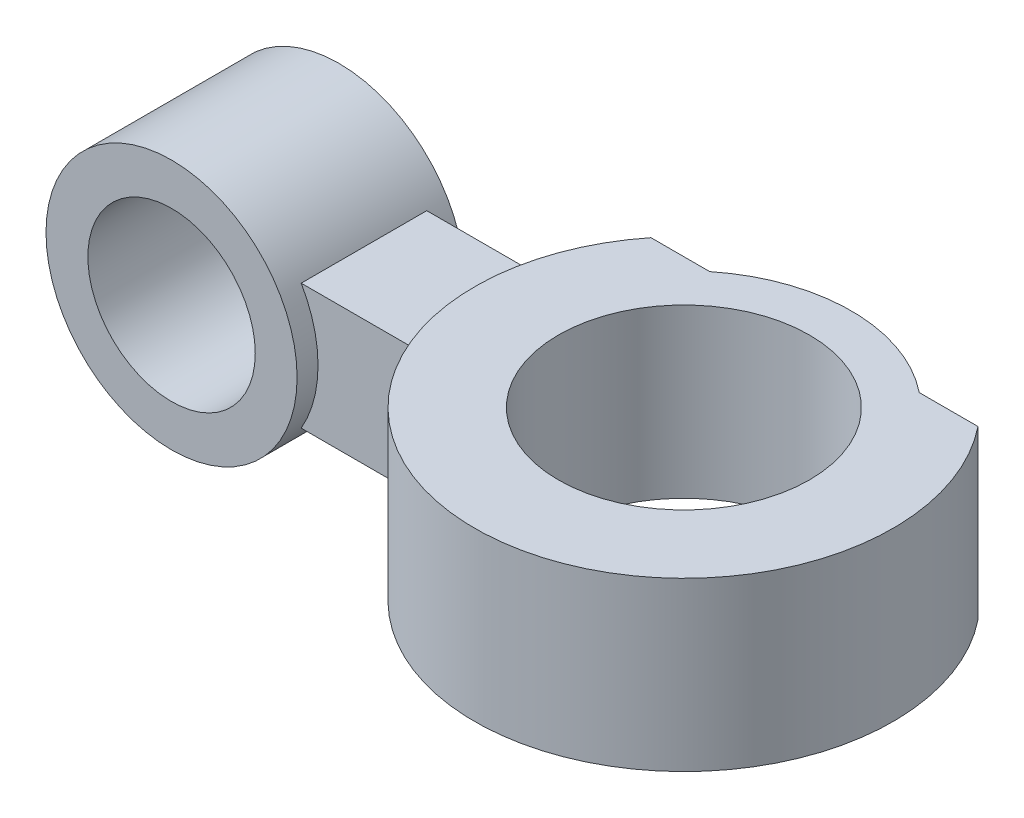
ISO-10303-21;
HEADER;
FILE_DESCRIPTION(('STEP AP214'),'2;1');
FILE_NAME('part.step','',(''),(''),'','','');
FILE_SCHEMA(('AUTOMOTIVE_DESIGN { 1 0 10303 214 1 1 1 1 }'));
ENDSEC;
DATA;
#1=APPLICATION_CONTEXT('core data for automotive mechanical design processes');
#2=APPLICATION_PROTOCOL_DEFINITION('international standard','automotive_design',2000,#1);
#3=PRODUCT_CONTEXT('',#1,'mechanical');
#4=PRODUCT('Part','Part','',(#3));
#5=PRODUCT_RELATED_PRODUCT_CATEGORY('part','',(#4));
#6=PRODUCT_DEFINITION_FORMATION('','',#4);
#7=PRODUCT_DEFINITION_CONTEXT('part definition',#1,'design');
#8=PRODUCT_DEFINITION('design','',#6,#7);
#9=PRODUCT_DEFINITION_SHAPE('','',#8);
#10=(LENGTH_UNIT() NAMED_UNIT(*) SI_UNIT(.MILLI.,.METRE.));
#11=(NAMED_UNIT(*) PLANE_ANGLE_UNIT() SI_UNIT($,.RADIAN.));
#12=(NAMED_UNIT(*) SI_UNIT($,.STERADIAN.) SOLID_ANGLE_UNIT());
#13=UNCERTAINTY_MEASURE_WITH_UNIT(LENGTH_MEASURE(1.E-05),#10,'distance_accuracy_value','');
#14=(GEOMETRIC_REPRESENTATION_CONTEXT(3) GLOBAL_UNCERTAINTY_ASSIGNED_CONTEXT((#13)) GLOBAL_UNIT_ASSIGNED_CONTEXT((#10,
#11,#12)) REPRESENTATION_CONTEXT('',''));
#15=CARTESIAN_POINT('',(0.,0.,0.));
#16=DIRECTION('',(0.,0.,1.));
#17=DIRECTION('',(1.,0.,0.));
#18=AXIS2_PLACEMENT_3D('',#15,#16,#17);
#19=CARTESIAN_POINT('',(5.12132034355964,1.,1.));
#20=DIRECTION('',(0.,-1.,0.));
#21=DIRECTION('',(0.,0.,-1.));
#22=AXIS2_PLACEMENT_3D('',#19,#20,#21);
#23=CYLINDRICAL_SURFACE('',#22,2.5);
#24=CARTESIAN_POINT('',(5.12132034355964,-1.,1.));
#25=DIRECTION('',(0.,1.,0.));
#26=DIRECTION('',(0.,0.,1.));
#27=AXIS2_PLACEMENT_3D('',#24,#25,#26);
#28=CIRCLE('',#27,2.5);
#29=CARTESIAN_POINT('',(3.16775949219105,-1.,-0.56));
#30=VERTEX_POINT('',#29);
#31=CARTESIAN_POINT('',(7.07488119492824,-1.,-0.56));
#32=VERTEX_POINT('',#31);
#33=EDGE_CURVE('E159',#30,#32,#28,.T.);
#34=ORIENTED_EDGE('',*,*,#33,.T.);
#35=DIRECTION('',(0.,-1.,0.));
#36=VECTOR('',#35,1.);
#37=CARTESIAN_POINT('',(7.07488119492824,1.,-0.56));
#38=LINE('',#37,#36);
#39=CARTESIAN_POINT('',(7.07488119492824,1.,-0.56));
#40=VERTEX_POINT('',#39);
#41=EDGE_CURVE('E11',#40,#32,#38,.T.);
#42=ORIENTED_EDGE('',*,*,#41,.F.);
#43=CARTESIAN_POINT('',(5.12132034355964,1.,1.));
#44=DIRECTION('',(0.,1.,0.));
#45=DIRECTION('',(0.,0.,1.));
#46=AXIS2_PLACEMENT_3D('',#43,#44,#45);
#47=CIRCLE('',#46,2.5);
#48=CARTESIAN_POINT('',(3.16775949219105,1.,-0.56));
#49=VERTEX_POINT('',#48);
#50=EDGE_CURVE('E162',#49,#40,#47,.T.);
#51=ORIENTED_EDGE('',*,*,#50,.F.);
#52=DIRECTION('',(0.,-1.,0.));
#53=VECTOR('',#52,1.);
#54=CARTESIAN_POINT('',(3.16775949219105,1.,-0.56));
#55=LINE('',#54,#53);
#56=EDGE_CURVE('E172',#49,#30,#55,.T.);
#57=ORIENTED_EDGE('',*,*,#56,.T.);
#58=EDGE_LOOP('',(#34,#42,#51,#57));
#59=FACE_BOUND('',#58,.T.);
#60=CARTESIAN_POINT('',(5.12132034355964,0.750000000000001,1.));
#61=DIRECTION('',(0.,-1.,0.));
#62=DIRECTION('',(1.,0.,0.));
#63=AXIS2_PLACEMENT_3D('',#60,#61,#62);
#64=CIRCLE('',#63,2.5);
#65=CARTESIAN_POINT('',(2.73647234001728,0.75,0.25));
#66=VERTEX_POINT('',#65);
#67=CARTESIAN_POINT('',(2.73647234001728,0.750000000000002,1.75));
#68=VERTEX_POINT('',#67);
#69=EDGE_CURVE('E61',#66,#68,#64,.F.);
#70=ORIENTED_EDGE('',*,*,#69,.T.);
#71=DIRECTION('',(0.,-1.,0.));
#72=VECTOR('',#71,1.);
#73=CARTESIAN_POINT('',(2.73647234001728,1.,1.75));
#74=LINE('',#73,#72);
#75=CARTESIAN_POINT('',(2.73647234001728,-0.749999999999999,1.75));
#76=VERTEX_POINT('',#75);
#77=EDGE_CURVE('E147',#68,#76,#74,.T.);
#78=ORIENTED_EDGE('',*,*,#77,.T.);
#79=CARTESIAN_POINT('',(5.12132034355964,-0.749999999999999,1.));
#80=DIRECTION('',(0.,1.,0.));
#81=DIRECTION('',(-1.,0.,0.));
#82=AXIS2_PLACEMENT_3D('',#79,#80,#81);
#83=CIRCLE('',#82,2.5);
#84=CARTESIAN_POINT('',(2.73647234001728,-0.749999999999999,0.25));
#85=VERTEX_POINT('',#84);
#86=EDGE_CURVE('E143',#76,#85,#83,.F.);
#87=ORIENTED_EDGE('',*,*,#86,.T.);
#88=DIRECTION('',(0.,-1.,0.));
#89=VECTOR('',#88,1.);
#90=CARTESIAN_POINT('',(2.73647234001728,1.,0.25));
#91=LINE('',#90,#89);
#92=EDGE_CURVE('E57',#85,#66,#91,.F.);
#93=ORIENTED_EDGE('',*,*,#92,.T.);
#94=EDGE_LOOP('',(#70,#78,#87,#93));
#95=FACE_BOUND('',#94,.T.);
#96=ADVANCED_FACE('F43',(#59,#95),#23,.T.);
#97=CARTESIAN_POINT('',(5.12132034355964,1.,1.));
#98=DIRECTION('',(0.,1.,0.));
#99=DIRECTION('',(0.,0.,1.));
#100=AXIS2_PLACEMENT_3D('',#97,#98,#99);
#101=PLANE('',#100);
#102=ORIENTED_EDGE('',*,*,#50,.T.);
#103=DIRECTION('',(-1.,0.,0.));
#104=VECTOR('',#103,1.);
#105=CARTESIAN_POINT('',(6.3728793713326,1.,-0.56));
#106=LINE('',#105,#104);
#107=CARTESIAN_POINT('',(6.3728793713326,1.,-0.56));
#108=VERTEX_POINT('',#107);
#109=EDGE_CURVE('E165',#40,#108,#106,.T.);
#110=ORIENTED_EDGE('',*,*,#109,.T.);
#111=CARTESIAN_POINT('',(5.12132034355964,1.,1.));
#112=DIRECTION('',(0.,1.,0.));
#113=DIRECTION('',(0.,0.,1.));
#114=AXIS2_PLACEMENT_3D('',#111,#112,#113);
#115=CIRCLE('',#114,2.);
#116=CARTESIAN_POINT('',(3.86976131578668,1.,-0.56));
#117=VERTEX_POINT('',#116);
#118=EDGE_CURVE('E168',#108,#117,#115,.T.);
#119=ORIENTED_EDGE('',*,*,#118,.T.);
#120=DIRECTION('',(-1.,0.,0.));
#121=VECTOR('',#120,1.);
#122=CARTESIAN_POINT('',(3.86976131578668,1.,-0.56));
#123=LINE('',#122,#121);
#124=EDGE_CURVE('E170',#117,#49,#123,.T.);
#125=ORIENTED_EDGE('',*,*,#124,.T.);
#126=EDGE_LOOP('',(#102,#110,#119,#125));
#127=FACE_BOUND('',#126,.T.);
#128=CARTESIAN_POINT('',(5.12132034355964,1.,1.));
#129=DIRECTION('',(0.,1.,0.));
#130=DIRECTION('',(0.,0.,1.));
#131=AXIS2_PLACEMENT_3D('',#128,#129,#130);
#132=CIRCLE('',#131,1.5);
#133=CARTESIAN_POINT('',(5.12132034355964,1.,2.5));
#134=VERTEX_POINT('',#133);
#135=EDGE_CURVE('E156',#134,#134,#132,.T.);
#136=ORIENTED_EDGE('',*,*,#135,.F.);
#137=EDGE_LOOP('',(#136));
#138=FACE_BOUND('',#137,.T.);
#139=ADVANCED_FACE('F205',(#127,#138),#101,.T.);
#140=CARTESIAN_POINT('',(5.12132034355964,-1.,1.));
#141=DIRECTION('',(0.,1.,0.));
#142=DIRECTION('',(0.,0.,1.));
#143=AXIS2_PLACEMENT_3D('',#140,#141,#142);
#144=PLANE('',#143);
#145=ORIENTED_EDGE('',*,*,#33,.F.);
#146=DIRECTION('',(-1.,0.,0.));
#147=VECTOR('',#146,1.);
#148=CARTESIAN_POINT('',(3.86976131578668,-1.,-0.56));
#149=LINE('',#148,#147);
#150=CARTESIAN_POINT('',(3.86976131578668,-1.,-0.56));
#151=VERTEX_POINT('',#150);
#152=EDGE_CURVE('E166',#151,#30,#149,.T.);
#153=ORIENTED_EDGE('',*,*,#152,.F.);
#154=CARTESIAN_POINT('',(5.12132034355964,-1.,1.));
#155=DIRECTION('',(0.,1.,0.));
#156=DIRECTION('',(0.,0.,1.));
#157=AXIS2_PLACEMENT_3D('',#154,#155,#156);
#158=CIRCLE('',#157,2.);
#159=CARTESIAN_POINT('',(6.3728793713326,-1.,-0.56));
#160=VERTEX_POINT('',#159);
#161=EDGE_CURVE('E177',#160,#151,#158,.T.);
#162=ORIENTED_EDGE('',*,*,#161,.F.);
#163=DIRECTION('',(-1.,0.,0.));
#164=VECTOR('',#163,1.);
#165=CARTESIAN_POINT('',(6.3728793713326,-1.,-0.56));
#166=LINE('',#165,#164);
#167=EDGE_CURVE('E175',#32,#160,#166,.T.);
#168=ORIENTED_EDGE('',*,*,#167,.F.);
#169=EDGE_LOOP('',(#145,#153,#162,#168));
#170=FACE_BOUND('',#169,.T.);
#171=CARTESIAN_POINT('',(5.12132034355964,-1.,1.));
#172=DIRECTION('',(0.,1.,0.));
#173=DIRECTION('',(0.,0.,1.));
#174=AXIS2_PLACEMENT_3D('',#171,#172,#173);
#175=CIRCLE('',#174,1.5);
#176=CARTESIAN_POINT('',(5.12132034355964,-1.,2.5));
#177=VERTEX_POINT('',#176);
#178=EDGE_CURVE('E150',#177,#177,#175,.T.);
#179=ORIENTED_EDGE('',*,*,#178,.T.);
#180=EDGE_LOOP('',(#179));
#181=FACE_BOUND('',#180,.T.);
#182=ADVANCED_FACE('F195',(#170,#181),#144,.F.);
#183=CARTESIAN_POINT('',(6.3728793713326,1.,-0.56));
#184=DIRECTION('',(0.,0.,1.));
#185=DIRECTION('',(1.,0.,0.));
#186=AXIS2_PLACEMENT_3D('',#183,#184,#185);
#187=PLANE('',#186);
#188=ORIENTED_EDGE('',*,*,#167,.T.);
#189=DIRECTION('',(0.,-1.,0.));
#190=VECTOR('',#189,1.);
#191=CARTESIAN_POINT('',(6.3728793713326,1.,-0.56));
#192=LINE('',#191,#190);
#193=EDGE_CURVE('E50',#108,#160,#192,.T.);
#194=ORIENTED_EDGE('',*,*,#193,.F.);
#195=ORIENTED_EDGE('',*,*,#109,.F.);
#196=ORIENTED_EDGE('',*,*,#41,.T.);
#197=EDGE_LOOP('',(#188,#194,#195,#196));
#198=FACE_BOUND('',#197,.T.);
#199=ADVANCED_FACE('F207',(#198),#187,.F.);
#200=CARTESIAN_POINT('',(5.12132034355964,1.,1.));
#201=DIRECTION('',(0.,-1.,0.));
#202=DIRECTION('',(0.,0.,-1.));
#203=AXIS2_PLACEMENT_3D('',#200,#201,#202);
#204=CYLINDRICAL_SURFACE('',#203,2.);
#205=ORIENTED_EDGE('',*,*,#161,.T.);
#206=DIRECTION('',(0.,-1.,0.));
#207=VECTOR('',#206,1.);
#208=CARTESIAN_POINT('',(3.86976131578668,1.,-0.56));
#209=LINE('',#208,#207);
#210=EDGE_CURVE('E182',#117,#151,#209,.T.);
#211=ORIENTED_EDGE('',*,*,#210,.F.);
#212=ORIENTED_EDGE('',*,*,#118,.F.);
#213=ORIENTED_EDGE('',*,*,#193,.T.);
#214=EDGE_LOOP('',(#205,#211,#212,#213));
#215=FACE_BOUND('',#214,.T.);
#216=ADVANCED_FACE('F189',(#215),#204,.T.);
#217=CARTESIAN_POINT('',(3.86976131578668,1.,-0.56));
#218=DIRECTION('',(0.,0.,1.));
#219=DIRECTION('',(1.,0.,0.));
#220=AXIS2_PLACEMENT_3D('',#217,#218,#219);
#221=PLANE('',#220);
#222=ORIENTED_EDGE('',*,*,#152,.T.);
#223=ORIENTED_EDGE('',*,*,#56,.F.);
#224=ORIENTED_EDGE('',*,*,#124,.F.);
#225=ORIENTED_EDGE('',*,*,#210,.T.);
#226=EDGE_LOOP('',(#222,#223,#224,#225));
#227=FACE_BOUND('',#226,.T.);
#228=ADVANCED_FACE('F199',(#227),#221,.F.);
#229=CARTESIAN_POINT('',(5.12132034355964,1.,1.));
#230=DIRECTION('',(0.,-1.,0.));
#231=DIRECTION('',(0.,0.,-1.));
#232=AXIS2_PLACEMENT_3D('',#229,#230,#231);
#233=CYLINDRICAL_SURFACE('',#232,1.5);
#234=ORIENTED_EDGE('',*,*,#135,.T.);
#235=EDGE_LOOP('',(#234));
#236=FACE_BOUND('',#235,.T.);
#237=ORIENTED_EDGE('',*,*,#178,.F.);
#238=EDGE_LOOP('',(#237));
#239=FACE_BOUND('',#238,.T.);
#240=ADVANCED_FACE('F223',(#236,#239),#233,.F.);
#241=CARTESIAN_POINT('',(7.62332034355964,0.750000000000001,1.75));
#242=DIRECTION('',(0.,-1.,0.));
#243=DIRECTION('',(1.,0.,0.));
#244=AXIS2_PLACEMENT_3D('',#241,#242,#243);
#245=PLANE('',#244);
#246=ORIENTED_EDGE('',*,*,#69,.F.);
#247=DIRECTION('',(-1.,0.,0.));
#248=VECTOR('',#247,1.);
#249=CARTESIAN_POINT('',(7.62332034355964,0.750000000000001,0.25));
#250=LINE('',#249,#248);
#251=CARTESIAN_POINT('',(1.29903810567666,0.75,0.25));
#252=VERTEX_POINT('',#251);
#253=EDGE_CURVE('E105',#66,#252,#250,.T.);
#254=ORIENTED_EDGE('',*,*,#253,.T.);
#255=DIRECTION('',(0.,0.,-1.));
#256=VECTOR('',#255,1.);
#257=CARTESIAN_POINT('',(1.29903810567666,0.75,1.75));
#258=LINE('',#257,#256);
#259=CARTESIAN_POINT('',(1.29903810567666,0.75,1.75));
#260=VERTEX_POINT('',#259);
#261=EDGE_CURVE('E109',#260,#252,#258,.T.);
#262=ORIENTED_EDGE('',*,*,#261,.F.);
#263=DIRECTION('',(-1.,0.,0.));
#264=VECTOR('',#263,1.);
#265=CARTESIAN_POINT('',(7.62332034355964,0.750000000000001,1.75));
#266=LINE('',#265,#264);
#267=EDGE_CURVE('E112',#68,#260,#266,.T.);
#268=ORIENTED_EDGE('',*,*,#267,.F.);
#269=EDGE_LOOP('',(#246,#254,#262,#268));
#270=FACE_BOUND('',#269,.T.);
#271=ADVANCED_FACE('F107',(#270),#245,.F.);
#272=CARTESIAN_POINT('',(7.62332034355964,0.750000000000001,0.25));
#273=DIRECTION('',(0.,0.,1.));
#274=DIRECTION('',(1.,0.,0.));
#275=AXIS2_PLACEMENT_3D('',#272,#273,#274);
#276=PLANE('',#275);
#277=ORIENTED_EDGE('',*,*,#92,.F.);
#278=DIRECTION('',(-1.,0.,0.));
#279=VECTOR('',#278,1.);
#280=CARTESIAN_POINT('',(7.62332034355964,-0.749999999999998,0.25));
#281=LINE('',#280,#279);
#282=CARTESIAN_POINT('',(1.29903810567666,-0.75,0.25));
#283=VERTEX_POINT('',#282);
#284=EDGE_CURVE('E129',#85,#283,#281,.T.);
#285=ORIENTED_EDGE('',*,*,#284,.T.);
#286=CARTESIAN_POINT('',(0.,0.,0.25));
#287=DIRECTION('',(0.,0.,-1.));
#288=DIRECTION('',(1.,0.,0.));
#289=AXIS2_PLACEMENT_3D('',#286,#287,#288);
#290=CIRCLE('',#289,1.5);
#291=EDGE_CURVE('E120',#252,#283,#290,.T.);
#292=ORIENTED_EDGE('',*,*,#291,.F.);
#293=ORIENTED_EDGE('',*,*,#253,.F.);
#294=EDGE_LOOP('',(#277,#285,#292,#293));
#295=FACE_BOUND('',#294,.T.);
#296=ADVANCED_FACE('F127',(#295),#276,.F.);
#297=CARTESIAN_POINT('',(7.62332034355964,0.750000000000001,1.75));
#298=DIRECTION('',(0.,0.,-1.));
#299=DIRECTION('',(-1.,0.,0.));
#300=AXIS2_PLACEMENT_3D('',#297,#298,#299);
#301=PLANE('',#300);
#302=ORIENTED_EDGE('',*,*,#77,.F.);
#303=ORIENTED_EDGE('',*,*,#267,.T.);
#304=CARTESIAN_POINT('',(0.,0.,1.75));
#305=DIRECTION('',(0.,0.,-1.));
#306=DIRECTION('',(1.,0.,0.));
#307=AXIS2_PLACEMENT_3D('',#304,#305,#306);
#308=CIRCLE('',#307,1.5);
#309=CARTESIAN_POINT('',(1.29903810567666,-0.75,1.75));
#310=VERTEX_POINT('',#309);
#311=EDGE_CURVE('E123',#260,#310,#308,.T.);
#312=ORIENTED_EDGE('',*,*,#311,.T.);
#313=DIRECTION('',(-1.,0.,0.));
#314=VECTOR('',#313,1.);
#315=CARTESIAN_POINT('',(7.62332034355964,-0.749999999999998,1.75));
#316=LINE('',#315,#314);
#317=EDGE_CURVE('E151',#76,#310,#316,.T.);
#318=ORIENTED_EDGE('',*,*,#317,.F.);
#319=EDGE_LOOP('',(#302,#303,#312,#318));
#320=FACE_BOUND('',#319,.T.);
#321=ADVANCED_FACE('F239',(#320),#301,.F.);
#322=CARTESIAN_POINT('',(7.62332034355964,-0.749999999999998,1.75));
#323=DIRECTION('',(0.,1.,0.));
#324=DIRECTION('',(-1.,0.,0.));
#325=AXIS2_PLACEMENT_3D('',#322,#323,#324);
#326=PLANE('',#325);
#327=ORIENTED_EDGE('',*,*,#86,.F.);
#328=ORIENTED_EDGE('',*,*,#317,.T.);
#329=DIRECTION('',(0.,0.,-1.));
#330=VECTOR('',#329,1.);
#331=CARTESIAN_POINT('',(1.29903810567666,-0.750000000000001,1.75));
#332=LINE('',#331,#330);
#333=EDGE_CURVE('E125',#310,#283,#332,.T.);
#334=ORIENTED_EDGE('',*,*,#333,.T.);
#335=ORIENTED_EDGE('',*,*,#284,.F.);
#336=EDGE_LOOP('',(#327,#328,#334,#335));
#337=FACE_BOUND('',#336,.T.);
#338=ADVANCED_FACE('F231',(#337),#326,.F.);
#339=CARTESIAN_POINT('',(0.,0.,2.));
#340=DIRECTION('',(0.,0.,1.));
#341=DIRECTION('',(1.,0.,0.));
#342=AXIS2_PLACEMENT_3D('',#339,#340,#341);
#343=PLANE('',#342);
#344=CARTESIAN_POINT('',(0.,0.,2.));
#345=DIRECTION('',(0.,0.,1.));
#346=DIRECTION('',(1.,0.,0.));
#347=AXIS2_PLACEMENT_3D('',#344,#345,#346);
#348=CIRCLE('',#347,1.5);
#349=CARTESIAN_POINT('',(1.5,0.,2.));
#350=VERTEX_POINT('',#349);
#351=EDGE_CURVE('E140',#350,#350,#348,.T.);
#352=ORIENTED_EDGE('',*,*,#351,.T.);
#353=EDGE_LOOP('',(#352));
#354=FACE_BOUND('',#353,.T.);
#355=CARTESIAN_POINT('',(0.,0.,2.));
#356=DIRECTION('',(0.,0.,1.));
#357=DIRECTION('',(1.,0.,0.));
#358=AXIS2_PLACEMENT_3D('',#355,#356,#357);
#359=CIRCLE('',#358,1.);
#360=CARTESIAN_POINT('',(1.,0.,2.));
#361=VERTEX_POINT('',#360);
#362=EDGE_CURVE('E134',#361,#361,#359,.T.);
#363=ORIENTED_EDGE('',*,*,#362,.F.);
#364=EDGE_LOOP('',(#363));
#365=FACE_BOUND('',#364,.T.);
#366=ADVANCED_FACE('F236',(#354,#365),#343,.T.);
#367=CARTESIAN_POINT('',(0.,0.,0.));
#368=DIRECTION('',(0.,0.,1.));
#369=DIRECTION('',(1.,0.,0.));
#370=AXIS2_PLACEMENT_3D('',#367,#368,#369);
#371=PLANE('',#370);
#372=CARTESIAN_POINT('',(0.,0.,0.));
#373=DIRECTION('',(0.,0.,1.));
#374=DIRECTION('',(1.,0.,0.));
#375=AXIS2_PLACEMENT_3D('',#372,#373,#374);
#376=CIRCLE('',#375,1.5);
#377=CARTESIAN_POINT('',(1.5,0.,0.));
#378=VERTEX_POINT('',#377);
#379=EDGE_CURVE('E137',#378,#378,#376,.T.);
#380=ORIENTED_EDGE('',*,*,#379,.F.);
#381=EDGE_LOOP('',(#380));
#382=FACE_BOUND('',#381,.T.);
#383=CARTESIAN_POINT('',(0.,0.,0.));
#384=DIRECTION('',(0.,0.,1.));
#385=DIRECTION('',(1.,0.,0.));
#386=AXIS2_PLACEMENT_3D('',#383,#384,#385);
#387=CIRCLE('',#386,1.);
#388=CARTESIAN_POINT('',(1.,0.,0.));
#389=VERTEX_POINT('',#388);
#390=EDGE_CURVE('E124',#389,#389,#387,.T.);
#391=ORIENTED_EDGE('',*,*,#390,.T.);
#392=EDGE_LOOP('',(#391));
#393=FACE_BOUND('',#392,.T.);
#394=ADVANCED_FACE('F246',(#382,#393),#371,.F.);
#395=CARTESIAN_POINT('',(0.,0.,2.));
#396=DIRECTION('',(0.,0.,-1.));
#397=DIRECTION('',(-1.,0.,0.));
#398=AXIS2_PLACEMENT_3D('',#395,#396,#397);
#399=CYLINDRICAL_SURFACE('',#398,1.5);
#400=ORIENTED_EDGE('',*,*,#333,.F.);
#401=ORIENTED_EDGE('',*,*,#311,.F.);
#402=ORIENTED_EDGE('',*,*,#261,.T.);
#403=ORIENTED_EDGE('',*,*,#291,.T.);
#404=EDGE_LOOP('',(#400,#401,#402,#403));
#405=FACE_BOUND('',#404,.T.);
#406=ORIENTED_EDGE('',*,*,#351,.F.);
#407=EDGE_LOOP('',(#406));
#408=FACE_BOUND('',#407,.T.);
#409=ORIENTED_EDGE('',*,*,#379,.T.);
#410=EDGE_LOOP('',(#409));
#411=FACE_BOUND('',#410,.T.);
#412=ADVANCED_FACE('F118',(#405,#408,#411),#399,.T.);
#413=CARTESIAN_POINT('',(0.,0.,2.));
#414=DIRECTION('',(0.,0.,-1.));
#415=DIRECTION('',(-1.,0.,0.));
#416=AXIS2_PLACEMENT_3D('',#413,#414,#415);
#417=CYLINDRICAL_SURFACE('',#416,1.);
#418=ORIENTED_EDGE('',*,*,#362,.T.);
#419=EDGE_LOOP('',(#418));
#420=FACE_BOUND('',#419,.T.);
#421=ORIENTED_EDGE('',*,*,#390,.F.);
#422=EDGE_LOOP('',(#421));
#423=FACE_BOUND('',#422,.T.);
#424=ADVANCED_FACE('F293',(#420,#423),#417,.F.);
#425=CLOSED_SHELL('',(#96,#139,#182,#199,#216,#228,#240,#271,#296,#321,#338,#366,#394,#412,#424));
#426=MANIFOLD_SOLID_BREP('B2',#425);
#427=ADVANCED_BREP_SHAPE_REPRESENTATION('',(#18,#426),#14);
#428=SHAPE_DEFINITION_REPRESENTATION(#9,#427);
ENDSEC;
END-ISO-10303-21;
